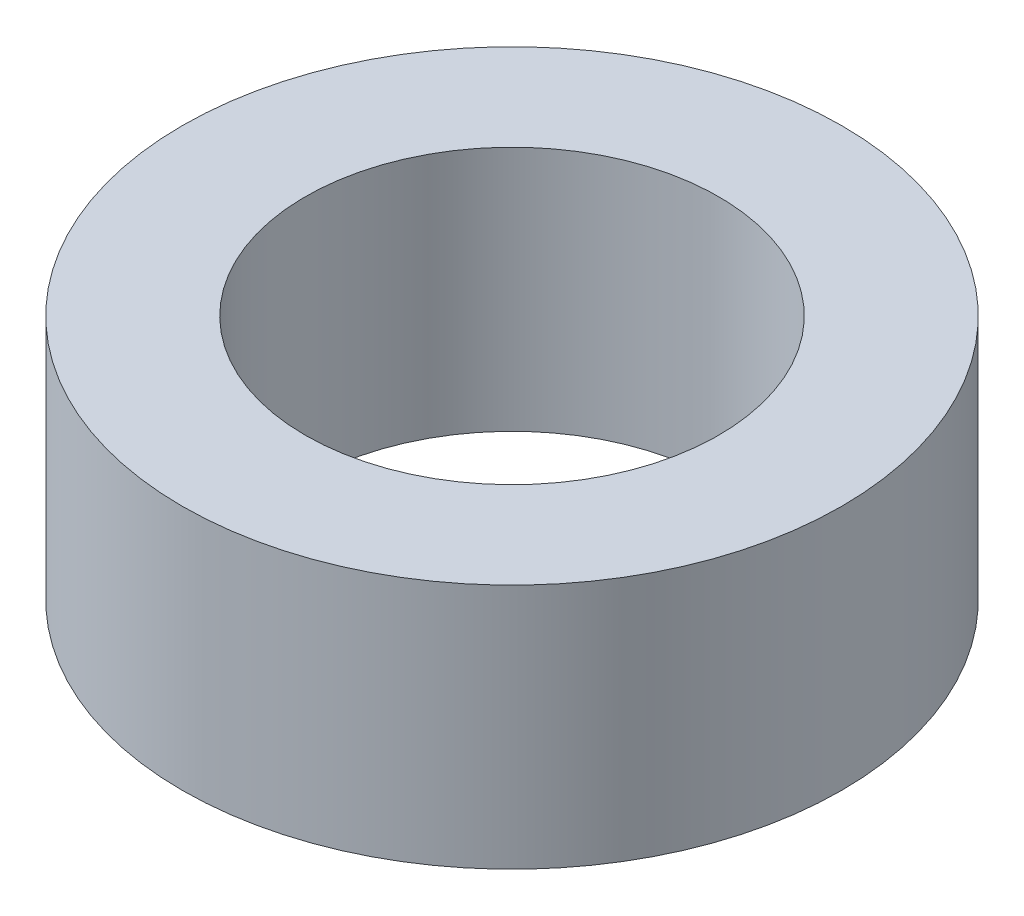
ISO-10303-21;
HEADER;
FILE_DESCRIPTION(('STEP AP214'),'2;1');
FILE_NAME('part.step','',(''),(''),'','','');
FILE_SCHEMA(('AUTOMOTIVE_DESIGN { 1 0 10303 214 1 1 1 1 }'));
ENDSEC;
DATA;
#1=APPLICATION_CONTEXT('core data for automotive mechanical design processes');
#2=APPLICATION_PROTOCOL_DEFINITION('international standard','automotive_design',2000,#1);
#3=PRODUCT_CONTEXT('',#1,'mechanical');
#4=PRODUCT('Part','Part','',(#3));
#5=PRODUCT_RELATED_PRODUCT_CATEGORY('part','',(#4));
#6=PRODUCT_DEFINITION_FORMATION('','',#4);
#7=PRODUCT_DEFINITION_CONTEXT('part definition',#1,'design');
#8=PRODUCT_DEFINITION('design','',#6,#7);
#9=PRODUCT_DEFINITION_SHAPE('','',#8);
#10=(LENGTH_UNIT() NAMED_UNIT(*) SI_UNIT(.MILLI.,.METRE.));
#11=(NAMED_UNIT(*) PLANE_ANGLE_UNIT() SI_UNIT($,.RADIAN.));
#12=(NAMED_UNIT(*) SI_UNIT($,.STERADIAN.) SOLID_ANGLE_UNIT());
#13=UNCERTAINTY_MEASURE_WITH_UNIT(LENGTH_MEASURE(1.E-05),#10,'distance_accuracy_value','');
#14=(GEOMETRIC_REPRESENTATION_CONTEXT(3) GLOBAL_UNCERTAINTY_ASSIGNED_CONTEXT((#13)) GLOBAL_UNIT_ASSIGNED_CONTEXT((#10,
#11,#12)) REPRESENTATION_CONTEXT('',''));
#15=CARTESIAN_POINT('',(0.,0.,0.));
#16=DIRECTION('',(0.,0.,1.));
#17=DIRECTION('',(1.,0.,0.));
#18=AXIS2_PLACEMENT_3D('',#15,#16,#17);
#19=CARTESIAN_POINT('',(0.,2.5,0.));
#20=DIRECTION('',(0.,1.,0.));
#21=DIRECTION('',(0.,0.,1.));
#22=AXIS2_PLACEMENT_3D('',#19,#20,#21);
#23=PLANE('',#22);
#24=CARTESIAN_POINT('',(0.,2.5,0.));
#25=DIRECTION('',(0.,1.,0.));
#26=DIRECTION('',(0.,0.,1.));
#27=AXIS2_PLACEMENT_3D('',#24,#25,#26);
#28=CIRCLE('',#27,3.35);
#29=CARTESIAN_POINT('',(0.,2.5,3.35));
#30=VERTEX_POINT('',#29);
#31=EDGE_CURVE('E10',#30,#30,#28,.T.);
#32=ORIENTED_EDGE('',*,*,#31,.T.);
#33=EDGE_LOOP('',(#32));
#34=FACE_BOUND('',#33,.T.);
#35=CARTESIAN_POINT('',(0.,2.5,0.));
#36=DIRECTION('',(0.,1.,0.));
#37=DIRECTION('',(0.,0.,1.));
#38=AXIS2_PLACEMENT_3D('',#35,#36,#37);
#39=CIRCLE('',#38,2.1);
#40=CARTESIAN_POINT('',(0.,2.5,2.1));
#41=VERTEX_POINT('',#40);
#42=EDGE_CURVE('E56',#41,#41,#39,.T.);
#43=ORIENTED_EDGE('',*,*,#42,.F.);
#44=EDGE_LOOP('',(#43));
#45=FACE_BOUND('',#44,.T.);
#46=ADVANCED_FACE('F43',(#34,#45),#23,.T.);
#47=CARTESIAN_POINT('',(0.,0.,0.));
#48=DIRECTION('',(0.,1.,0.));
#49=DIRECTION('',(0.,0.,1.));
#50=AXIS2_PLACEMENT_3D('',#47,#48,#49);
#51=PLANE('',#50);
#52=CARTESIAN_POINT('',(0.,0.,0.));
#53=DIRECTION('',(0.,1.,0.));
#54=DIRECTION('',(0.,0.,1.));
#55=AXIS2_PLACEMENT_3D('',#52,#53,#54);
#56=CIRCLE('',#55,3.35);
#57=CARTESIAN_POINT('',(0.,0.,3.35));
#58=VERTEX_POINT('',#57);
#59=EDGE_CURVE('E47',#58,#58,#56,.T.);
#60=ORIENTED_EDGE('',*,*,#59,.F.);
#61=EDGE_LOOP('',(#60));
#62=FACE_BOUND('',#61,.T.);
#63=CARTESIAN_POINT('',(0.,0.,0.));
#64=DIRECTION('',(0.,1.,0.));
#65=DIRECTION('',(0.,0.,1.));
#66=AXIS2_PLACEMENT_3D('',#63,#64,#65);
#67=CIRCLE('',#66,2.1);
#68=CARTESIAN_POINT('',(0.,0.,2.1));
#69=VERTEX_POINT('',#68);
#70=EDGE_CURVE('E58',#69,#69,#67,.T.);
#71=ORIENTED_EDGE('',*,*,#70,.T.);
#72=EDGE_LOOP('',(#71));
#73=FACE_BOUND('',#72,.T.);
#74=ADVANCED_FACE('F70',(#62,#73),#51,.F.);
#75=CARTESIAN_POINT('',(0.,2.5,0.));
#76=DIRECTION('',(0.,-1.,0.));
#77=DIRECTION('',(0.,0.,-1.));
#78=AXIS2_PLACEMENT_3D('',#75,#76,#77);
#79=CYLINDRICAL_SURFACE('',#78,3.35);
#80=ORIENTED_EDGE('',*,*,#31,.F.);
#81=EDGE_LOOP('',(#80));
#82=FACE_BOUND('',#81,.T.);
#83=ORIENTED_EDGE('',*,*,#59,.T.);
#84=EDGE_LOOP('',(#83));
#85=FACE_BOUND('',#84,.T.);
#86=ADVANCED_FACE('F45',(#82,#85),#79,.T.);
#87=CARTESIAN_POINT('',(0.,2.5,0.));
#88=DIRECTION('',(0.,-1.,0.));
#89=DIRECTION('',(0.,0.,-1.));
#90=AXIS2_PLACEMENT_3D('',#87,#88,#89);
#91=CYLINDRICAL_SURFACE('',#90,2.1);
#92=ORIENTED_EDGE('',*,*,#42,.T.);
#93=EDGE_LOOP('',(#92));
#94=FACE_BOUND('',#93,.T.);
#95=ORIENTED_EDGE('',*,*,#70,.F.);
#96=EDGE_LOOP('',(#95));
#97=FACE_BOUND('',#96,.T.);
#98=ADVANCED_FACE('F66',(#94,#97),#91,.F.);
#99=CLOSED_SHELL('',(#46,#74,#86,#98));
#100=MANIFOLD_SOLID_BREP('B2',#99);
#101=ADVANCED_BREP_SHAPE_REPRESENTATION('',(#18,#100),#14);
#102=SHAPE_DEFINITION_REPRESENTATION(#9,#101);
ENDSEC;
END-ISO-10303-21;
